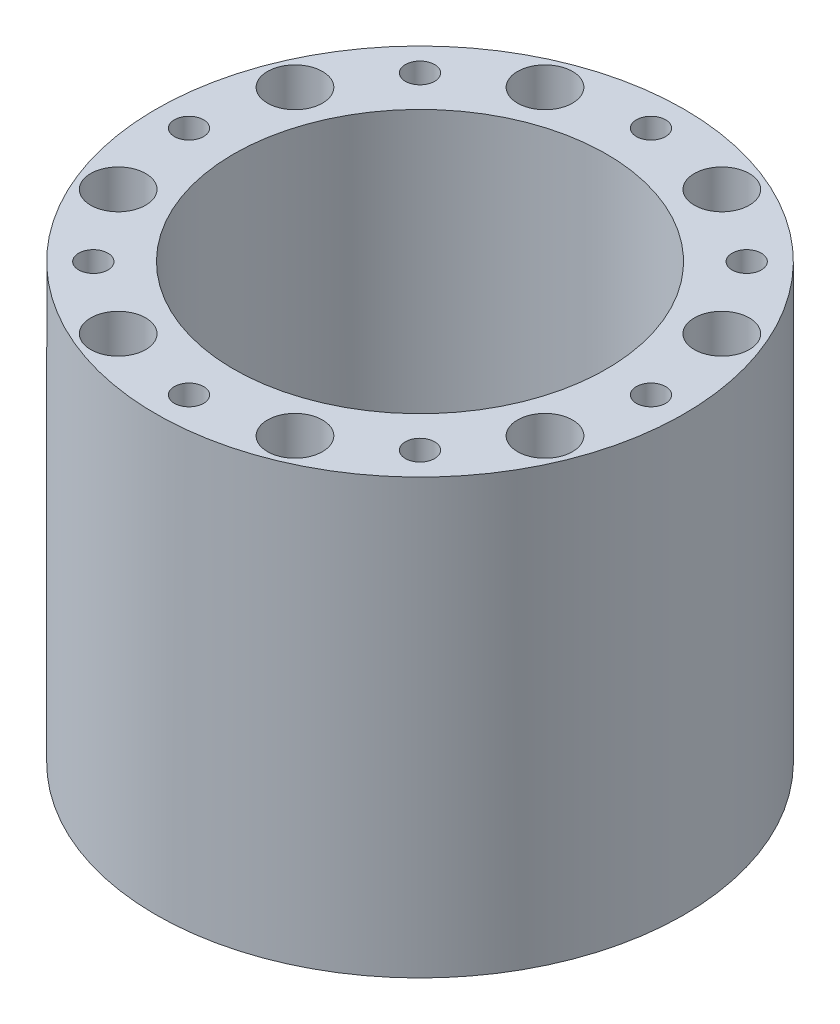
ISO-10303-21;
HEADER;
FILE_DESCRIPTION(('STEP AP214'),'2;1');
FILE_NAME('part.step','',(''),(''),'','','');
FILE_SCHEMA(('AUTOMOTIVE_DESIGN { 1 0 10303 214 1 1 1 1 }'));
ENDSEC;
DATA;
#1=APPLICATION_CONTEXT('core data for automotive mechanical design processes');
#2=APPLICATION_PROTOCOL_DEFINITION('international standard','automotive_design',2000,#1);
#3=PRODUCT_CONTEXT('',#1,'mechanical');
#4=PRODUCT('Part','Part','',(#3));
#5=PRODUCT_RELATED_PRODUCT_CATEGORY('part','',(#4));
#6=PRODUCT_DEFINITION_FORMATION('','',#4);
#7=PRODUCT_DEFINITION_CONTEXT('part definition',#1,'design');
#8=PRODUCT_DEFINITION('design','',#6,#7);
#9=PRODUCT_DEFINITION_SHAPE('','',#8);
#10=(LENGTH_UNIT() NAMED_UNIT(*) SI_UNIT(.MILLI.,.METRE.));
#11=(NAMED_UNIT(*) PLANE_ANGLE_UNIT() SI_UNIT($,.RADIAN.));
#12=(NAMED_UNIT(*) SI_UNIT($,.STERADIAN.) SOLID_ANGLE_UNIT());
#13=UNCERTAINTY_MEASURE_WITH_UNIT(LENGTH_MEASURE(1.E-05),#10,'distance_accuracy_value','');
#14=(GEOMETRIC_REPRESENTATION_CONTEXT(3) GLOBAL_UNCERTAINTY_ASSIGNED_CONTEXT((#13)) GLOBAL_UNIT_ASSIGNED_CONTEXT((#10,
#11,#12)) REPRESENTATION_CONTEXT('',''));
#15=CARTESIAN_POINT('',(0.,0.,0.));
#16=DIRECTION('',(0.,0.,1.));
#17=DIRECTION('',(1.,0.,0.));
#18=AXIS2_PLACEMENT_3D('',#15,#16,#17);
#19=CARTESIAN_POINT('',(63.7922857500392,0.,41.677143361624));
#20=DIRECTION('',(0.,-1.,0.));
#21=DIRECTION('',(0.546944138603989,0.,-0.837169104331222));
#22=AXIS2_PLACEMENT_3D('',#19,#20,#21);
#23=PLANE('',#22);
#24=CARTESIAN_POINT('',(61.5996678301902,0.,-25.515417852942));
#25=DIRECTION('',(0.,1.,0.));
#26=DIRECTION('',(0.,0.,1.));
#27=AXIS2_PLACEMENT_3D('',#24,#25,#26);
#28=CIRCLE('',#27,7.93750000000001);
#29=CARTESIAN_POINT('',(61.5996678301902,0.,-17.577917852942));
#30=VERTEX_POINT('',#29);
#31=EDGE_CURVE('E634',#30,#30,#28,.T.);
#32=ORIENTED_EDGE('',*,*,#31,.F.);
#33=EDGE_LOOP('',(#32));
#34=FACE_BOUND('',#33,.T.);
#35=CARTESIAN_POINT('',(25.5154178529426,0.,-61.59966783019));
#36=DIRECTION('',(0.,1.,0.));
#37=DIRECTION('',(0.,0.,1.));
#38=AXIS2_PLACEMENT_3D('',#35,#36,#37);
#39=CIRCLE('',#38,7.9375);
#40=CARTESIAN_POINT('',(25.5154178529426,0.,-53.66216783019));
#41=VERTEX_POINT('',#40);
#42=EDGE_CURVE('E644',#41,#41,#39,.T.);
#43=ORIENTED_EDGE('',*,*,#42,.F.);
#44=EDGE_LOOP('',(#43));
#45=FACE_BOUND('',#44,.T.);
#46=CARTESIAN_POINT('',(-25.5154178529422,0.,-61.5996678301901));
#47=DIRECTION('',(0.,1.,0.));
#48=DIRECTION('',(0.,0.,1.));
#49=AXIS2_PLACEMENT_3D('',#46,#47,#48);
#50=CIRCLE('',#49,7.9375);
#51=CARTESIAN_POINT('',(-25.5154178529422,0.,-53.6621678301901));
#52=VERTEX_POINT('',#51);
#53=EDGE_CURVE('E656',#52,#52,#50,.T.);
#54=ORIENTED_EDGE('',*,*,#53,.F.);
#55=EDGE_LOOP('',(#54));
#56=FACE_BOUND('',#55,.T.);
#57=CARTESIAN_POINT('',(25.5154178529427,0.,61.5996678301899));
#58=DIRECTION('',(0.,1.,0.));
#59=DIRECTION('',(0.,0.,1.));
#60=AXIS2_PLACEMENT_3D('',#57,#58,#59);
#61=CIRCLE('',#60,7.9375);
#62=CARTESIAN_POINT('',(25.5154178529427,0.,69.5371678301899));
#63=VERTEX_POINT('',#62);
#64=EDGE_CURVE('E211',#63,#63,#61,.T.);
#65=ORIENTED_EDGE('',*,*,#64,.F.);
#66=EDGE_LOOP('',(#65));
#67=FACE_BOUND('',#66,.T.);
#68=CARTESIAN_POINT('',(47.1463446356136,0.,-47.1463446356125));
#69=DIRECTION('',(0.,1.,0.));
#70=DIRECTION('',(0.,0.,1.));
#71=AXIS2_PLACEMENT_3D('',#68,#69,#70);
#72=CIRCLE('',#71,4.21639999999999);
#73=CARTESIAN_POINT('',(47.1463446356136,0.,-42.9299446356125));
#74=VERTEX_POINT('',#73);
#75=EDGE_CURVE('E85',#74,#74,#72,.T.);
#76=ORIENTED_EDGE('',*,*,#75,.F.);
#77=EDGE_LOOP('',(#76));
#78=FACE_BOUND('',#77,.T.);
#79=CARTESIAN_POINT('',(6.98383554802098E-13,0.,-66.675));
#80=DIRECTION('',(0.,1.,0.));
#81=DIRECTION('',(0.,0.,1.));
#82=AXIS2_PLACEMENT_3D('',#79,#80,#81);
#83=CIRCLE('',#82,4.21639999999999);
#84=CARTESIAN_POINT('',(6.98383554802098E-13,0.,-62.4586));
#85=VERTEX_POINT('',#84);
#86=EDGE_CURVE('E84',#85,#85,#83,.T.);
#87=ORIENTED_EDGE('',*,*,#86,.F.);
#88=EDGE_LOOP('',(#87));
#89=FACE_BOUND('',#88,.T.);
#90=CARTESIAN_POINT('',(-47.1463446356126,0.,-47.1463446356135));
#91=DIRECTION('',(0.,1.,0.));
#92=DIRECTION('',(0.,0.,1.));
#93=AXIS2_PLACEMENT_3D('',#90,#91,#92);
#94=CIRCLE('',#93,4.21639999999999);
#95=CARTESIAN_POINT('',(-47.1463446356126,0.,-42.9299446356135));
#96=VERTEX_POINT('',#95);
#97=EDGE_CURVE('E97',#96,#96,#94,.T.);
#98=ORIENTED_EDGE('',*,*,#97,.F.);
#99=EDGE_LOOP('',(#98));
#100=FACE_BOUND('',#99,.T.);
#101=CARTESIAN_POINT('',(-66.675,0.,0.));
#102=DIRECTION('',(0.,1.,0.));
#103=DIRECTION('',(0.,0.,1.));
#104=AXIS2_PLACEMENT_3D('',#101,#102,#103);
#105=CIRCLE('',#104,4.21639999999999);
#106=CARTESIAN_POINT('',(-66.675,0.,4.21639999999999));
#107=VERTEX_POINT('',#106);
#108=EDGE_CURVE('E103',#107,#107,#105,.T.);
#109=ORIENTED_EDGE('',*,*,#108,.F.);
#110=EDGE_LOOP('',(#109));
#111=FACE_BOUND('',#110,.T.);
#112=CARTESIAN_POINT('',(-47.1463446356133,0.,47.1463446356128));
#113=DIRECTION('',(0.,1.,0.));
#114=DIRECTION('',(0.,0.,1.));
#115=AXIS2_PLACEMENT_3D('',#112,#113,#114);
#116=CIRCLE('',#115,4.21639999999999);
#117=CARTESIAN_POINT('',(-47.1463446356133,0.,51.3627446356128));
#118=VERTEX_POINT('',#117);
#119=EDGE_CURVE('E109',#118,#118,#116,.T.);
#120=ORIENTED_EDGE('',*,*,#119,.F.);
#121=EDGE_LOOP('',(#120));
#122=FACE_BOUND('',#121,.T.);
#123=CARTESIAN_POINT('',(-2.32794518267366E-13,0.,66.675));
#124=DIRECTION('',(0.,1.,0.));
#125=DIRECTION('',(0.,0.,1.));
#126=AXIS2_PLACEMENT_3D('',#123,#124,#125);
#127=CIRCLE('',#126,4.21639999999999);
#128=CARTESIAN_POINT('',(-2.32794518267366E-13,0.,70.8914));
#129=VERTEX_POINT('',#128);
#130=EDGE_CURVE('E115',#129,#129,#127,.T.);
#131=ORIENTED_EDGE('',*,*,#130,.F.);
#132=EDGE_LOOP('',(#131));
#133=FACE_BOUND('',#132,.T.);
#134=CARTESIAN_POINT('',(47.146344635613,0.,47.1463446356131));
#135=DIRECTION('',(0.,1.,0.));
#136=DIRECTION('',(0.,0.,1.));
#137=AXIS2_PLACEMENT_3D('',#134,#135,#136);
#138=CIRCLE('',#137,4.21639999999999);
#139=CARTESIAN_POINT('',(47.146344635613,0.,51.3627446356131));
#140=VERTEX_POINT('',#139);
#141=EDGE_CURVE('E121',#140,#140,#138,.T.);
#142=ORIENTED_EDGE('',*,*,#141,.F.);
#143=EDGE_LOOP('',(#142));
#144=FACE_BOUND('',#143,.T.);
#145=CARTESIAN_POINT('',(66.675,0.,0.));
#146=DIRECTION('',(0.,1.,0.));
#147=DIRECTION('',(0.,0.,1.));
#148=AXIS2_PLACEMENT_3D('',#145,#146,#147);
#149=CIRCLE('',#148,4.21639999999999);
#150=CARTESIAN_POINT('',(66.675,0.,4.21639999999999));
#151=VERTEX_POINT('',#150);
#152=EDGE_CURVE('E127',#151,#151,#149,.T.);
#153=ORIENTED_EDGE('',*,*,#152,.F.);
#154=EDGE_LOOP('',(#153));
#155=FACE_BOUND('',#154,.T.);
#156=CARTESIAN_POINT('',(0.,0.,0.));
#157=DIRECTION('',(0.,-1.,0.));
#158=DIRECTION('',(0.546944138603989,0.,-0.837169104331222));
#159=AXIS2_PLACEMENT_3D('',#156,#157,#158);
#160=CIRCLE('',#159,76.2);
#161=CARTESIAN_POINT('',(41.6771433616239,0.,-63.7922857500391));
#162=VERTEX_POINT('',#161);
#163=EDGE_CURVE('E133',#162,#162,#160,.T.);
#164=ORIENTED_EDGE('',*,*,#163,.F.);
#165=EDGE_LOOP('',(#164));
#166=FACE_BOUND('',#165,.T.);
#167=CARTESIAN_POINT('',(0.,0.,0.));
#168=DIRECTION('',(0.,-1.,0.));
#169=DIRECTION('',(0.546944138603989,0.,-0.837169104331222));
#170=AXIS2_PLACEMENT_3D('',#167,#168,#169);
#171=CIRCLE('',#170,53.7924602426016);
#172=CARTESIAN_POINT('',(29.421470830779,0.,-45.0333857610717));
#173=VERTEX_POINT('',#172);
#174=EDGE_CURVE('E136',#173,#173,#171,.T.);
#175=ORIENTED_EDGE('',*,*,#174,.T.);
#176=EDGE_LOOP('',(#175));
#177=FACE_BOUND('',#176,.T.);
#178=CARTESIAN_POINT('',(61.5996678301902,0.,25.515417852942));
#179=DIRECTION('',(0.,1.,0.));
#180=DIRECTION('',(0.,0.,1.));
#181=AXIS2_PLACEMENT_3D('',#178,#179,#180);
#182=CIRCLE('',#181,7.9375);
#183=CARTESIAN_POINT('',(61.5996678301902,0.,33.452917852942));
#184=VERTEX_POINT('',#183);
#185=EDGE_CURVE('E162',#184,#184,#182,.T.);
#186=ORIENTED_EDGE('',*,*,#185,.F.);
#187=EDGE_LOOP('',(#186));
#188=FACE_BOUND('',#187,.T.);
#189=CARTESIAN_POINT('',(-25.5154178529422,0.,61.5996678301901));
#190=DIRECTION('',(0.,1.,0.));
#191=DIRECTION('',(0.,0.,1.));
#192=AXIS2_PLACEMENT_3D('',#189,#190,#191);
#193=CIRCLE('',#192,7.9375);
#194=CARTESIAN_POINT('',(-25.5154178529422,0.,69.5371678301901));
#195=VERTEX_POINT('',#194);
#196=EDGE_CURVE('E166',#195,#195,#193,.T.);
#197=ORIENTED_EDGE('',*,*,#196,.F.);
#198=EDGE_LOOP('',(#197));
#199=FACE_BOUND('',#198,.T.);
#200=CARTESIAN_POINT('',(-61.59966783019,0.,25.5154178529424));
#201=DIRECTION('',(0.,1.,0.));
#202=DIRECTION('',(0.,0.,1.));
#203=AXIS2_PLACEMENT_3D('',#200,#201,#202);
#204=CIRCLE('',#203,7.9375);
#205=CARTESIAN_POINT('',(-61.59966783019,0.,33.4529178529424));
#206=VERTEX_POINT('',#205);
#207=EDGE_CURVE('E170',#206,#206,#204,.T.);
#208=ORIENTED_EDGE('',*,*,#207,.F.);
#209=EDGE_LOOP('',(#208));
#210=FACE_BOUND('',#209,.T.);
#211=CARTESIAN_POINT('',(-61.5996678301902,0.,-25.515417852942));
#212=DIRECTION('',(0.,1.,0.));
#213=DIRECTION('',(0.,0.,1.));
#214=AXIS2_PLACEMENT_3D('',#211,#212,#213);
#215=CIRCLE('',#214,7.9375);
#216=CARTESIAN_POINT('',(-61.5996678301902,0.,-17.577917852942));
#217=VERTEX_POINT('',#216);
#218=EDGE_CURVE('E173',#217,#217,#215,.T.);
#219=ORIENTED_EDGE('',*,*,#218,.F.);
#220=EDGE_LOOP('',(#219));
#221=FACE_BOUND('',#220,.T.);
#222=ADVANCED_FACE('F41',(#34,#45,#56,#67,#78,#89,#100,#111,#122,#133,#144,#155,#166,#177,#188,
#199,#210,#221),#23,.F.);
#223=CARTESIAN_POINT('',(-105.474898553049,-125.205020782532,22.1235140794585));
#224=DIRECTION('',(0.,1.,0.));
#225=DIRECTION('',(-0.546944138603989,0.,0.837169104331222));
#226=AXIS2_PLACEMENT_3D('',#223,#224,#225);
#227=PLANE('',#226);
#228=CARTESIAN_POINT('',(61.5996678301902,-125.205020782532,-25.515417852942));
#229=DIRECTION('',(0.,1.,0.));
#230=DIRECTION('',(0.,0.,1.));
#231=AXIS2_PLACEMENT_3D('',#228,#229,#230);
#232=CIRCLE('',#231,4.90219999999997);
#233=CARTESIAN_POINT('',(61.5996678301902,-125.205020782532,-20.613217852942));
#234=VERTEX_POINT('',#233);
#235=EDGE_CURVE('E641',#234,#234,#232,.T.);
#236=ORIENTED_EDGE('',*,*,#235,.T.);
#237=EDGE_LOOP('',(#236));
#238=FACE_BOUND('',#237,.T.);
#239=CARTESIAN_POINT('',(25.5154178529426,-125.205020782532,-61.59966783019));
#240=DIRECTION('',(0.,1.,0.));
#241=DIRECTION('',(0.,0.,1.));
#242=AXIS2_PLACEMENT_3D('',#239,#240,#241);
#243=CIRCLE('',#242,4.90219999999997);
#244=CARTESIAN_POINT('',(25.5154178529426,-125.205020782532,-56.69746783019));
#245=VERTEX_POINT('',#244);
#246=EDGE_CURVE('E653',#245,#245,#243,.T.);
#247=ORIENTED_EDGE('',*,*,#246,.T.);
#248=EDGE_LOOP('',(#247));
#249=FACE_BOUND('',#248,.T.);
#250=CARTESIAN_POINT('',(-25.5154178529422,-125.205020782532,-61.5996678301901));
#251=DIRECTION('',(0.,1.,0.));
#252=DIRECTION('',(0.,0.,1.));
#253=AXIS2_PLACEMENT_3D('',#250,#251,#252);
#254=CIRCLE('',#253,4.90219999999997);
#255=CARTESIAN_POINT('',(-25.5154178529422,-125.205020782532,-56.6974678301901));
#256=VERTEX_POINT('',#255);
#257=EDGE_CURVE('E176',#256,#256,#254,.T.);
#258=ORIENTED_EDGE('',*,*,#257,.T.);
#259=EDGE_LOOP('',(#258));
#260=FACE_BOUND('',#259,.T.);
#261=CARTESIAN_POINT('',(-61.5996678301902,-125.205020782532,-25.515417852942));
#262=DIRECTION('',(0.,1.,0.));
#263=DIRECTION('',(0.,0.,1.));
#264=AXIS2_PLACEMENT_3D('',#261,#262,#263);
#265=CIRCLE('',#264,4.90219999999997);
#266=CARTESIAN_POINT('',(-61.5996678301902,-125.205020782532,-20.613217852942));
#267=VERTEX_POINT('',#266);
#268=EDGE_CURVE('E188',#267,#267,#265,.T.);
#269=ORIENTED_EDGE('',*,*,#268,.T.);
#270=EDGE_LOOP('',(#269));
#271=FACE_BOUND('',#270,.T.);
#272=CARTESIAN_POINT('',(-61.59966783019,-125.205020782532,25.5154178529424));
#273=DIRECTION('',(0.,1.,0.));
#274=DIRECTION('',(0.,0.,1.));
#275=AXIS2_PLACEMENT_3D('',#272,#273,#274);
#276=CIRCLE('',#275,4.90219999999997);
#277=CARTESIAN_POINT('',(-61.59966783019,-125.205020782532,30.4176178529424));
#278=VERTEX_POINT('',#277);
#279=EDGE_CURVE('E198',#278,#278,#276,.T.);
#280=ORIENTED_EDGE('',*,*,#279,.T.);
#281=EDGE_LOOP('',(#280));
#282=FACE_BOUND('',#281,.T.);
#283=CARTESIAN_POINT('',(-25.5154178529422,-125.205020782532,61.5996678301901));
#284=DIRECTION('',(0.,1.,0.));
#285=DIRECTION('',(0.,0.,1.));
#286=AXIS2_PLACEMENT_3D('',#283,#284,#285);
#287=CIRCLE('',#286,4.90219999999997);
#288=CARTESIAN_POINT('',(-25.5154178529422,-125.205020782532,66.5018678301901));
#289=VERTEX_POINT('',#288);
#290=EDGE_CURVE('E208',#289,#289,#287,.T.);
#291=ORIENTED_EDGE('',*,*,#290,.T.);
#292=EDGE_LOOP('',(#291));
#293=FACE_BOUND('',#292,.T.);
#294=CARTESIAN_POINT('',(25.5154178529427,-125.205020782532,61.5996678301899));
#295=DIRECTION('',(0.,1.,0.));
#296=DIRECTION('',(0.,0.,1.));
#297=AXIS2_PLACEMENT_3D('',#294,#295,#296);
#298=CIRCLE('',#297,4.90219999999997);
#299=CARTESIAN_POINT('',(25.5154178529427,-125.205020782532,66.5018678301899));
#300=VERTEX_POINT('',#299);
#301=EDGE_CURVE('E220',#300,#300,#298,.T.);
#302=ORIENTED_EDGE('',*,*,#301,.T.);
#303=EDGE_LOOP('',(#302));
#304=FACE_BOUND('',#303,.T.);
#305=CARTESIAN_POINT('',(61.5996678301902,-125.205020782532,25.515417852942));
#306=DIRECTION('',(0.,1.,0.));
#307=DIRECTION('',(0.,0.,1.));
#308=AXIS2_PLACEMENT_3D('',#305,#306,#307);
#309=CIRCLE('',#308,4.90219999999997);
#310=CARTESIAN_POINT('',(61.5996678301902,-125.205020782532,30.4176178529419));
#311=VERTEX_POINT('',#310);
#312=EDGE_CURVE('E91',#311,#311,#309,.T.);
#313=ORIENTED_EDGE('',*,*,#312,.T.);
#314=EDGE_LOOP('',(#313));
#315=FACE_BOUND('',#314,.T.);
#316=CARTESIAN_POINT('',(0.,-125.205020782532,0.));
#317=DIRECTION('',(0.,1.,0.));
#318=DIRECTION('',(-0.546944138603989,0.,0.837169104331222));
#319=AXIS2_PLACEMENT_3D('',#316,#317,#318);
#320=CIRCLE('',#319,76.2);
#321=CARTESIAN_POINT('',(-41.6771433616239,-125.205020782532,63.7922857500391));
#322=VERTEX_POINT('',#321);
#323=EDGE_CURVE('E49',#322,#322,#320,.T.);
#324=ORIENTED_EDGE('',*,*,#323,.F.);
#325=EDGE_LOOP('',(#324));
#326=FACE_BOUND('',#325,.T.);
#327=CARTESIAN_POINT('',(0.,-125.205020782532,0.));
#328=DIRECTION('',(0.,1.,0.));
#329=DIRECTION('',(-0.546944138603989,0.,0.837169104331222));
#330=AXIS2_PLACEMENT_3D('',#327,#328,#329);
#331=CIRCLE('',#330,53.7924602426016);
#332=CARTESIAN_POINT('',(-29.421470830779,-125.205020782532,45.0333857610717));
#333=VERTEX_POINT('',#332);
#334=EDGE_CURVE('E11',#333,#333,#331,.F.);
#335=ORIENTED_EDGE('',*,*,#334,.F.);
#336=EDGE_LOOP('',(#335));
#337=FACE_BOUND('',#336,.T.);
#338=ADVANCED_FACE('F43',(#238,#249,#260,#271,#282,#293,#304,#315,#326,#337),#227,.F.);
#339=CARTESIAN_POINT('',(0.,-193.077673705898,0.));
#340=DIRECTION('',(0.,-1.,0.));
#341=DIRECTION('',(0.546944138603989,0.,-0.837169104331222));
#342=AXIS2_PLACEMENT_3D('',#339,#340,#341);
#343=CYLINDRICAL_SURFACE('',#342,76.2);
#344=ORIENTED_EDGE('',*,*,#323,.T.);
#345=EDGE_LOOP('',(#344));
#346=FACE_BOUND('',#345,.T.);
#347=ORIENTED_EDGE('',*,*,#163,.T.);
#348=EDGE_LOOP('',(#347));
#349=FACE_BOUND('',#348,.T.);
#350=ADVANCED_FACE('F141',(#346,#349),#343,.T.);
#351=CARTESIAN_POINT('',(0.,-193.077673705898,0.));
#352=DIRECTION('',(0.,-1.,0.));
#353=DIRECTION('',(0.546944138603989,0.,-0.837169104331222));
#354=AXIS2_PLACEMENT_3D('',#351,#352,#353);
#355=CYLINDRICAL_SURFACE('',#354,53.7924602426016);
#356=ORIENTED_EDGE('',*,*,#334,.T.);
#357=EDGE_LOOP('',(#356));
#358=FACE_BOUND('',#357,.T.);
#359=ORIENTED_EDGE('',*,*,#174,.F.);
#360=EDGE_LOOP('',(#359));
#361=FACE_BOUND('',#360,.T.);
#362=ADVANCED_FACE('F147',(#358,#361),#355,.F.);
#363=CARTESIAN_POINT('',(66.675,-27.30754,0.));
#364=DIRECTION('',(0.,1.,0.));
#365=DIRECTION('',(0.,0.,1.));
#366=AXIS2_PLACEMENT_3D('',#363,#364,#365);
#367=CONICAL_SURFACE('',#366,4.21639999999999,1.02974425867665);
#368=CARTESIAN_POINT('',(66.675,-29.8410087140678,0.));
#369=VERTEX_POINT('',#368);
#370=VERTEX_LOOP('',#369);
#371=FACE_BOUND('',#370,.T.);
#372=CARTESIAN_POINT('',(66.675,-27.30754,0.));
#373=DIRECTION('',(0.,1.,0.));
#374=DIRECTION('',(0.,0.,1.));
#375=AXIS2_PLACEMENT_3D('',#372,#373,#374);
#376=CIRCLE('',#375,4.21639999999999);
#377=CARTESIAN_POINT('',(66.675,-27.30754,4.21639999999999));
#378=VERTEX_POINT('',#377);
#379=EDGE_CURVE('E130',#378,#378,#376,.T.);
#380=ORIENTED_EDGE('',*,*,#379,.T.);
#381=EDGE_LOOP('',(#380));
#382=FACE_BOUND('',#381,.T.);
#383=ADVANCED_FACE('F152',(#371,#382),#367,.F.);
#384=CARTESIAN_POINT('',(66.675,0.,0.));
#385=DIRECTION('',(0.,1.,0.));
#386=DIRECTION('',(0.,0.,1.));
#387=AXIS2_PLACEMENT_3D('',#384,#385,#386);
#388=CYLINDRICAL_SURFACE('',#387,4.21639999999999);
#389=ORIENTED_EDGE('',*,*,#379,.F.);
#390=EDGE_LOOP('',(#389));
#391=FACE_BOUND('',#390,.T.);
#392=ORIENTED_EDGE('',*,*,#152,.T.);
#393=EDGE_LOOP('',(#392));
#394=FACE_BOUND('',#393,.T.);
#395=ADVANCED_FACE('F306',(#391,#394),#388,.F.);
#396=CARTESIAN_POINT('',(47.146344635613,-27.30754,47.1463446356131));
#397=DIRECTION('',(0.,1.,0.));
#398=DIRECTION('',(0.,0.,1.));
#399=AXIS2_PLACEMENT_3D('',#396,#397,#398);
#400=CONICAL_SURFACE('',#399,4.21639999999999,1.02974425867665);
#401=CARTESIAN_POINT('',(47.146344635613,-29.8410087140678,47.1463446356131));
#402=VERTEX_POINT('',#401);
#403=VERTEX_LOOP('',#402);
#404=FACE_BOUND('',#403,.T.);
#405=CARTESIAN_POINT('',(47.146344635613,-27.30754,47.1463446356131));
#406=DIRECTION('',(0.,1.,0.));
#407=DIRECTION('',(0.,0.,1.));
#408=AXIS2_PLACEMENT_3D('',#405,#406,#407);
#409=CIRCLE('',#408,4.21639999999999);
#410=CARTESIAN_POINT('',(47.146344635613,-27.30754,51.3627446356131));
#411=VERTEX_POINT('',#410);
#412=EDGE_CURVE('E124',#411,#411,#409,.T.);
#413=ORIENTED_EDGE('',*,*,#412,.T.);
#414=EDGE_LOOP('',(#413));
#415=FACE_BOUND('',#414,.T.);
#416=ADVANCED_FACE('F302',(#404,#415),#400,.F.);
#417=CARTESIAN_POINT('',(47.146344635613,0.,47.1463446356131));
#418=DIRECTION('',(0.,1.,0.));
#419=DIRECTION('',(0.,0.,1.));
#420=AXIS2_PLACEMENT_3D('',#417,#418,#419);
#421=CYLINDRICAL_SURFACE('',#420,4.21639999999999);
#422=ORIENTED_EDGE('',*,*,#412,.F.);
#423=EDGE_LOOP('',(#422));
#424=FACE_BOUND('',#423,.T.);
#425=ORIENTED_EDGE('',*,*,#141,.T.);
#426=EDGE_LOOP('',(#425));
#427=FACE_BOUND('',#426,.T.);
#428=ADVANCED_FACE('F298',(#424,#427),#421,.F.);
#429=CARTESIAN_POINT('',(-2.32794518267366E-13,-27.30754,66.675));
#430=DIRECTION('',(0.,1.,0.));
#431=DIRECTION('',(0.,0.,1.));
#432=AXIS2_PLACEMENT_3D('',#429,#430,#431);
#433=CONICAL_SURFACE('',#432,4.21639999999999,1.02974425867665);
#434=CARTESIAN_POINT('',(-2.40103457428368E-13,-29.8410087140678,66.675));
#435=VERTEX_POINT('',#434);
#436=VERTEX_LOOP('',#435);
#437=FACE_BOUND('',#436,.T.);
#438=CARTESIAN_POINT('',(-2.32794518267366E-13,-27.30754,66.675));
#439=DIRECTION('',(0.,1.,0.));
#440=DIRECTION('',(0.,0.,1.));
#441=AXIS2_PLACEMENT_3D('',#438,#439,#440);
#442=CIRCLE('',#441,4.21639999999999);
#443=CARTESIAN_POINT('',(-2.32794518267366E-13,-27.30754,70.8914));
#444=VERTEX_POINT('',#443);
#445=EDGE_CURVE('E118',#444,#444,#442,.T.);
#446=ORIENTED_EDGE('',*,*,#445,.T.);
#447=EDGE_LOOP('',(#446));
#448=FACE_BOUND('',#447,.T.);
#449=ADVANCED_FACE('F294',(#437,#448),#433,.F.);
#450=CARTESIAN_POINT('',(-2.32794518267366E-13,0.,66.675));
#451=DIRECTION('',(0.,1.,0.));
#452=DIRECTION('',(0.,0.,1.));
#453=AXIS2_PLACEMENT_3D('',#450,#451,#452);
#454=CYLINDRICAL_SURFACE('',#453,4.21639999999999);
#455=ORIENTED_EDGE('',*,*,#445,.F.);
#456=EDGE_LOOP('',(#455));
#457=FACE_BOUND('',#456,.T.);
#458=ORIENTED_EDGE('',*,*,#130,.T.);
#459=EDGE_LOOP('',(#458));
#460=FACE_BOUND('',#459,.T.);
#461=ADVANCED_FACE('F290',(#457,#460),#454,.F.);
#462=CARTESIAN_POINT('',(-47.1463446356133,-27.30754,47.1463446356128));
#463=DIRECTION('',(0.,1.,0.));
#464=DIRECTION('',(0.,0.,1.));
#465=AXIS2_PLACEMENT_3D('',#462,#463,#464);
#466=CONICAL_SURFACE('',#465,4.21639999999999,1.02974425867665);
#467=CARTESIAN_POINT('',(-47.1463446356133,-29.8410087140678,47.1463446356128));
#468=VERTEX_POINT('',#467);
#469=VERTEX_LOOP('',#468);
#470=FACE_BOUND('',#469,.T.);
#471=CARTESIAN_POINT('',(-47.1463446356133,-27.30754,47.1463446356128));
#472=DIRECTION('',(0.,1.,0.));
#473=DIRECTION('',(0.,0.,1.));
#474=AXIS2_PLACEMENT_3D('',#471,#472,#473);
#475=CIRCLE('',#474,4.21639999999999);
#476=CARTESIAN_POINT('',(-47.1463446356133,-27.30754,51.3627446356128));
#477=VERTEX_POINT('',#476);
#478=EDGE_CURVE('E112',#477,#477,#475,.T.);
#479=ORIENTED_EDGE('',*,*,#478,.T.);
#480=EDGE_LOOP('',(#479));
#481=FACE_BOUND('',#480,.T.);
#482=ADVANCED_FACE('F286',(#470,#481),#466,.F.);
#483=CARTESIAN_POINT('',(-47.1463446356133,0.,47.1463446356128));
#484=DIRECTION('',(0.,1.,0.));
#485=DIRECTION('',(0.,0.,1.));
#486=AXIS2_PLACEMENT_3D('',#483,#484,#485);
#487=CYLINDRICAL_SURFACE('',#486,4.21639999999999);
#488=ORIENTED_EDGE('',*,*,#478,.F.);
#489=EDGE_LOOP('',(#488));
#490=FACE_BOUND('',#489,.T.);
#491=ORIENTED_EDGE('',*,*,#119,.T.);
#492=EDGE_LOOP('',(#491));
#493=FACE_BOUND('',#492,.T.);
#494=ADVANCED_FACE('F282',(#490,#493),#487,.F.);
#495=CARTESIAN_POINT('',(-66.675,-27.30754,0.));
#496=DIRECTION('',(0.,1.,0.));
#497=DIRECTION('',(0.,0.,1.));
#498=AXIS2_PLACEMENT_3D('',#495,#496,#497);
#499=CONICAL_SURFACE('',#498,4.21639999999999,1.02974425867665);
#500=CARTESIAN_POINT('',(-66.675,-29.8410087140678,0.));
#501=VERTEX_POINT('',#500);
#502=VERTEX_LOOP('',#501);
#503=FACE_BOUND('',#502,.T.);
#504=CARTESIAN_POINT('',(-66.675,-27.30754,0.));
#505=DIRECTION('',(0.,1.,0.));
#506=DIRECTION('',(0.,0.,1.));
#507=AXIS2_PLACEMENT_3D('',#504,#505,#506);
#508=CIRCLE('',#507,4.21639999999999);
#509=CARTESIAN_POINT('',(-66.675,-27.30754,4.21639999999999));
#510=VERTEX_POINT('',#509);
#511=EDGE_CURVE('E106',#510,#510,#508,.T.);
#512=ORIENTED_EDGE('',*,*,#511,.T.);
#513=EDGE_LOOP('',(#512));
#514=FACE_BOUND('',#513,.T.);
#515=ADVANCED_FACE('F278',(#503,#514),#499,.F.);
#516=CARTESIAN_POINT('',(-66.675,0.,0.));
#517=DIRECTION('',(0.,1.,0.));
#518=DIRECTION('',(0.,0.,1.));
#519=AXIS2_PLACEMENT_3D('',#516,#517,#518);
#520=CYLINDRICAL_SURFACE('',#519,4.21639999999999);
#521=ORIENTED_EDGE('',*,*,#511,.F.);
#522=EDGE_LOOP('',(#521));
#523=FACE_BOUND('',#522,.T.);
#524=ORIENTED_EDGE('',*,*,#108,.T.);
#525=EDGE_LOOP('',(#524));
#526=FACE_BOUND('',#525,.T.);
#527=ADVANCED_FACE('F274',(#523,#526),#520,.F.);
#528=CARTESIAN_POINT('',(-47.1463446356126,-27.30754,-47.1463446356135));
#529=DIRECTION('',(0.,1.,0.));
#530=DIRECTION('',(0.,0.,1.));
#531=AXIS2_PLACEMENT_3D('',#528,#529,#530);
#532=CONICAL_SURFACE('',#531,4.21639999999999,1.02974425867665);
#533=CARTESIAN_POINT('',(-47.1463446356126,-29.8410087140678,-47.1463446356135));
#534=VERTEX_POINT('',#533);
#535=VERTEX_LOOP('',#534);
#536=FACE_BOUND('',#535,.T.);
#537=CARTESIAN_POINT('',(-47.1463446356126,-27.30754,-47.1463446356135));
#538=DIRECTION('',(0.,1.,0.));
#539=DIRECTION('',(0.,0.,1.));
#540=AXIS2_PLACEMENT_3D('',#537,#538,#539);
#541=CIRCLE('',#540,4.21639999999999);
#542=CARTESIAN_POINT('',(-47.1463446356126,-27.30754,-42.9299446356135));
#543=VERTEX_POINT('',#542);
#544=EDGE_CURVE('E100',#543,#543,#541,.T.);
#545=ORIENTED_EDGE('',*,*,#544,.T.);
#546=EDGE_LOOP('',(#545));
#547=FACE_BOUND('',#546,.T.);
#548=ADVANCED_FACE('F270',(#536,#547),#532,.F.);
#549=CARTESIAN_POINT('',(-47.1463446356126,0.,-47.1463446356135));
#550=DIRECTION('',(0.,1.,0.));
#551=DIRECTION('',(0.,0.,1.));
#552=AXIS2_PLACEMENT_3D('',#549,#550,#551);
#553=CYLINDRICAL_SURFACE('',#552,4.21639999999999);
#554=ORIENTED_EDGE('',*,*,#544,.F.);
#555=EDGE_LOOP('',(#554));
#556=FACE_BOUND('',#555,.T.);
#557=ORIENTED_EDGE('',*,*,#97,.T.);
#558=EDGE_LOOP('',(#557));
#559=FACE_BOUND('',#558,.T.);
#560=ADVANCED_FACE('F266',(#556,#559),#553,.F.);
#561=CARTESIAN_POINT('',(6.98383554802098E-13,-27.30754,-66.675));
#562=DIRECTION('',(0.,1.,0.));
#563=DIRECTION('',(0.,0.,1.));
#564=AXIS2_PLACEMENT_3D('',#561,#562,#563);
#565=CONICAL_SURFACE('',#564,4.21639999999999,1.02974425867665);
#566=CARTESIAN_POINT('',(6.91074615641096E-13,-29.8410087140678,-66.675));
#567=VERTEX_POINT('',#566);
#568=VERTEX_LOOP('',#567);
#569=FACE_BOUND('',#568,.T.);
#570=CARTESIAN_POINT('',(6.98383554802098E-13,-27.30754,-66.675));
#571=DIRECTION('',(0.,1.,0.));
#572=DIRECTION('',(0.,0.,1.));
#573=AXIS2_PLACEMENT_3D('',#570,#571,#572);
#574=CIRCLE('',#573,4.21639999999999);
#575=CARTESIAN_POINT('',(6.98383554802098E-13,-27.30754,-62.4586));
#576=VERTEX_POINT('',#575);
#577=EDGE_CURVE('E88',#576,#576,#574,.T.);
#578=ORIENTED_EDGE('',*,*,#577,.T.);
#579=EDGE_LOOP('',(#578));
#580=FACE_BOUND('',#579,.T.);
#581=ADVANCED_FACE('F262',(#569,#580),#565,.F.);
#582=CARTESIAN_POINT('',(6.98383554802098E-13,0.,-66.675));
#583=DIRECTION('',(0.,1.,0.));
#584=DIRECTION('',(0.,0.,1.));
#585=AXIS2_PLACEMENT_3D('',#582,#583,#584);
#586=CYLINDRICAL_SURFACE('',#585,4.21639999999999);
#587=ORIENTED_EDGE('',*,*,#577,.F.);
#588=EDGE_LOOP('',(#587));
#589=FACE_BOUND('',#588,.T.);
#590=ORIENTED_EDGE('',*,*,#86,.T.);
#591=EDGE_LOOP('',(#590));
#592=FACE_BOUND('',#591,.T.);
#593=ADVANCED_FACE('F78',(#589,#592),#586,.F.);
#594=CARTESIAN_POINT('',(47.1463446356136,-27.30754,-47.1463446356125));
#595=DIRECTION('',(0.,1.,0.));
#596=DIRECTION('',(0.,0.,1.));
#597=AXIS2_PLACEMENT_3D('',#594,#595,#596);
#598=CONICAL_SURFACE('',#597,4.21639999999999,1.02974425867665);
#599=CARTESIAN_POINT('',(47.1463446356136,-29.8410087140678,-47.1463446356125));
#600=VERTEX_POINT('',#599);
#601=VERTEX_LOOP('',#600);
#602=FACE_BOUND('',#601,.T.);
#603=CARTESIAN_POINT('',(47.1463446356136,-27.30754,-47.1463446356125));
#604=DIRECTION('',(0.,1.,0.));
#605=DIRECTION('',(0.,0.,1.));
#606=AXIS2_PLACEMENT_3D('',#603,#604,#605);
#607=CIRCLE('',#606,4.21639999999999);
#608=CARTESIAN_POINT('',(47.1463446356136,-27.30754,-42.9299446356125));
#609=VERTEX_POINT('',#608);
#610=EDGE_CURVE('E82',#609,#609,#607,.T.);
#611=ORIENTED_EDGE('',*,*,#610,.T.);
#612=EDGE_LOOP('',(#611));
#613=FACE_BOUND('',#612,.T.);
#614=ADVANCED_FACE('F74',(#602,#613),#598,.F.);
#615=CARTESIAN_POINT('',(47.1463446356136,0.,-47.1463446356125));
#616=DIRECTION('',(0.,1.,0.));
#617=DIRECTION('',(0.,0.,1.));
#618=AXIS2_PLACEMENT_3D('',#615,#616,#617);
#619=CYLINDRICAL_SURFACE('',#618,4.21639999999999);
#620=ORIENTED_EDGE('',*,*,#610,.F.);
#621=EDGE_LOOP('',(#620));
#622=FACE_BOUND('',#621,.T.);
#623=ORIENTED_EDGE('',*,*,#75,.T.);
#624=EDGE_LOOP('',(#623));
#625=FACE_BOUND('',#624,.T.);
#626=ADVANCED_FACE('F77',(#622,#625),#619,.F.);
#627=CARTESIAN_POINT('',(61.5996678301902,0.,25.515417852942));
#628=DIRECTION('',(0.,1.,0.));
#629=DIRECTION('',(0.,0.,1.));
#630=AXIS2_PLACEMENT_3D('',#627,#628,#629);
#631=CYLINDRICAL_SURFACE('',#630,4.90219999999999);
#632=ORIENTED_EDGE('',*,*,#312,.F.);
#633=EDGE_LOOP('',(#632));
#634=FACE_BOUND('',#633,.T.);
#635=CARTESIAN_POINT('',(61.5996678301902,-14.605,25.515417852942));
#636=DIRECTION('',(0.,1.,0.));
#637=DIRECTION('',(0.,0.,1.));
#638=AXIS2_PLACEMENT_3D('',#635,#636,#637);
#639=CIRCLE('',#638,4.90220000000001);
#640=CARTESIAN_POINT('',(61.5996678301902,-14.605,30.417617852942));
#641=VERTEX_POINT('',#640);
#642=EDGE_CURVE('E227',#641,#641,#639,.T.);
#643=ORIENTED_EDGE('',*,*,#642,.T.);
#644=EDGE_LOOP('',(#643));
#645=FACE_BOUND('',#644,.T.);
#646=ADVANCED_FACE('F233',(#634,#645),#631,.F.);
#647=CARTESIAN_POINT('',(66.5018678301902,-14.605,25.515417852942));
#648=DIRECTION('',(0.,-1.,0.));
#649=DIRECTION('',(0.,0.,-1.));
#650=AXIS2_PLACEMENT_3D('',#647,#648,#649);
#651=PLANE('',#650);
#652=ORIENTED_EDGE('',*,*,#642,.F.);
#653=EDGE_LOOP('',(#652));
#654=FACE_BOUND('',#653,.T.);
#655=CARTESIAN_POINT('',(61.5996678301902,-14.605,25.515417852942));
#656=DIRECTION('',(0.,1.,0.));
#657=DIRECTION('',(0.,0.,1.));
#658=AXIS2_PLACEMENT_3D('',#655,#656,#657);
#659=CIRCLE('',#658,7.9375);
#660=CARTESIAN_POINT('',(61.5996678301902,-14.605,33.452917852942));
#661=VERTEX_POINT('',#660);
#662=EDGE_CURVE('E224',#661,#661,#659,.T.);
#663=ORIENTED_EDGE('',*,*,#662,.T.);
#664=EDGE_LOOP('',(#663));
#665=FACE_BOUND('',#664,.T.);
#666=ADVANCED_FACE('F236',(#654,#665),#651,.F.);
#667=CARTESIAN_POINT('',(61.5996678301902,0.,25.515417852942));
#668=DIRECTION('',(0.,1.,0.));
#669=DIRECTION('',(0.,0.,1.));
#670=AXIS2_PLACEMENT_3D('',#667,#668,#669);
#671=CYLINDRICAL_SURFACE('',#670,7.9375);
#672=ORIENTED_EDGE('',*,*,#662,.F.);
#673=EDGE_LOOP('',(#672));
#674=FACE_BOUND('',#673,.T.);
#675=ORIENTED_EDGE('',*,*,#185,.T.);
#676=EDGE_LOOP('',(#675));
#677=FACE_BOUND('',#676,.T.);
#678=ADVANCED_FACE('F242',(#674,#677),#671,.F.);
#679=CARTESIAN_POINT('',(25.5154178529427,0.,61.5996678301899));
#680=DIRECTION('',(0.,1.,0.));
#681=DIRECTION('',(0.,0.,1.));
#682=AXIS2_PLACEMENT_3D('',#679,#680,#681);
#683=CYLINDRICAL_SURFACE('',#682,4.90219999999999);
#684=ORIENTED_EDGE('',*,*,#301,.F.);
#685=EDGE_LOOP('',(#684));
#686=FACE_BOUND('',#685,.T.);
#687=CARTESIAN_POINT('',(25.5154178529427,-14.605,61.5996678301899));
#688=DIRECTION('',(0.,1.,0.));
#689=DIRECTION('',(0.,0.,1.));
#690=AXIS2_PLACEMENT_3D('',#687,#688,#689);
#691=CIRCLE('',#690,4.90220000000001);
#692=CARTESIAN_POINT('',(25.5154178529427,-14.605,66.50186783019));
#693=VERTEX_POINT('',#692);
#694=EDGE_CURVE('E217',#693,#693,#691,.T.);
#695=ORIENTED_EDGE('',*,*,#694,.T.);
#696=EDGE_LOOP('',(#695));
#697=FACE_BOUND('',#696,.T.);
#698=ADVANCED_FACE('F248',(#686,#697),#683,.F.);
#699=CARTESIAN_POINT('',(30.4176178529427,-14.605,61.5996678301899));
#700=DIRECTION('',(0.,-1.,0.));
#701=DIRECTION('',(0.,0.,-1.));
#702=AXIS2_PLACEMENT_3D('',#699,#700,#701);
#703=PLANE('',#702);
#704=ORIENTED_EDGE('',*,*,#694,.F.);
#705=EDGE_LOOP('',(#704));
#706=FACE_BOUND('',#705,.T.);
#707=CARTESIAN_POINT('',(25.5154178529427,-14.605,61.5996678301899));
#708=DIRECTION('',(0.,1.,0.));
#709=DIRECTION('',(0.,0.,1.));
#710=AXIS2_PLACEMENT_3D('',#707,#708,#709);
#711=CIRCLE('',#710,7.9375);
#712=CARTESIAN_POINT('',(25.5154178529427,-14.605,69.5371678301899));
#713=VERTEX_POINT('',#712);
#714=EDGE_CURVE('E214',#713,#713,#711,.T.);
#715=ORIENTED_EDGE('',*,*,#714,.T.);
#716=EDGE_LOOP('',(#715));
#717=FACE_BOUND('',#716,.T.);
#718=ADVANCED_FACE('F253',(#706,#717),#703,.F.);
#719=CARTESIAN_POINT('',(25.5154178529427,0.,61.5996678301899));
#720=DIRECTION('',(0.,1.,0.));
#721=DIRECTION('',(0.,0.,1.));
#722=AXIS2_PLACEMENT_3D('',#719,#720,#721);
#723=CYLINDRICAL_SURFACE('',#722,7.9375);
#724=ORIENTED_EDGE('',*,*,#714,.F.);
#725=EDGE_LOOP('',(#724));
#726=FACE_BOUND('',#725,.T.);
#727=ORIENTED_EDGE('',*,*,#64,.T.);
#728=EDGE_LOOP('',(#727));
#729=FACE_BOUND('',#728,.T.);
#730=ADVANCED_FACE('F435',(#726,#729),#723,.F.);
#731=CARTESIAN_POINT('',(-25.5154178529422,0.,61.5996678301901));
#732=DIRECTION('',(0.,1.,0.));
#733=DIRECTION('',(0.,0.,1.));
#734=AXIS2_PLACEMENT_3D('',#731,#732,#733);
#735=CYLINDRICAL_SURFACE('',#734,4.90219999999999);
#736=ORIENTED_EDGE('',*,*,#290,.F.);
#737=EDGE_LOOP('',(#736));
#738=FACE_BOUND('',#737,.T.);
#739=CARTESIAN_POINT('',(-25.5154178529422,-14.605,61.5996678301901));
#740=DIRECTION('',(0.,1.,0.));
#741=DIRECTION('',(0.,0.,1.));
#742=AXIS2_PLACEMENT_3D('',#739,#740,#741);
#743=CIRCLE('',#742,4.90220000000001);
#744=CARTESIAN_POINT('',(-25.5154178529422,-14.605,66.5018678301901));
#745=VERTEX_POINT('',#744);
#746=EDGE_CURVE('E205',#745,#745,#743,.T.);
#747=ORIENTED_EDGE('',*,*,#746,.T.);
#748=EDGE_LOOP('',(#747));
#749=FACE_BOUND('',#748,.T.);
#750=ADVANCED_FACE('F444',(#738,#749),#735,.F.);
#751=CARTESIAN_POINT('',(-20.6132178529422,-14.605,61.5996678301901));
#752=DIRECTION('',(0.,-1.,0.));
#753=DIRECTION('',(0.,0.,-1.));
#754=AXIS2_PLACEMENT_3D('',#751,#752,#753);
#755=PLANE('',#754);
#756=ORIENTED_EDGE('',*,*,#746,.F.);
#757=EDGE_LOOP('',(#756));
#758=FACE_BOUND('',#757,.T.);
#759=CARTESIAN_POINT('',(-25.5154178529422,-14.605,61.5996678301901));
#760=DIRECTION('',(0.,1.,0.));
#761=DIRECTION('',(0.,0.,1.));
#762=AXIS2_PLACEMENT_3D('',#759,#760,#761);
#763=CIRCLE('',#762,7.9375);
#764=CARTESIAN_POINT('',(-25.5154178529422,-14.605,69.5371678301901));
#765=VERTEX_POINT('',#764);
#766=EDGE_CURVE('E202',#765,#765,#763,.T.);
#767=ORIENTED_EDGE('',*,*,#766,.T.);
#768=EDGE_LOOP('',(#767));
#769=FACE_BOUND('',#768,.T.);
#770=ADVANCED_FACE('F454',(#758,#769),#755,.F.);
#771=CARTESIAN_POINT('',(-25.5154178529422,0.,61.5996678301901));
#772=DIRECTION('',(0.,1.,0.));
#773=DIRECTION('',(0.,0.,1.));
#774=AXIS2_PLACEMENT_3D('',#771,#772,#773);
#775=CYLINDRICAL_SURFACE('',#774,7.9375);
#776=ORIENTED_EDGE('',*,*,#766,.F.);
#777=EDGE_LOOP('',(#776));
#778=FACE_BOUND('',#777,.T.);
#779=ORIENTED_EDGE('',*,*,#196,.T.);
#780=EDGE_LOOP('',(#779));
#781=FACE_BOUND('',#780,.T.);
#782=ADVANCED_FACE('F464',(#778,#781),#775,.F.);
#783=CARTESIAN_POINT('',(-61.59966783019,0.,25.5154178529424));
#784=DIRECTION('',(0.,1.,0.));
#785=DIRECTION('',(0.,0.,1.));
#786=AXIS2_PLACEMENT_3D('',#783,#784,#785);
#787=CYLINDRICAL_SURFACE('',#786,4.90219999999999);
#788=ORIENTED_EDGE('',*,*,#279,.F.);
#789=EDGE_LOOP('',(#788));
#790=FACE_BOUND('',#789,.T.);
#791=CARTESIAN_POINT('',(-61.59966783019,-14.605,25.5154178529424));
#792=DIRECTION('',(0.,1.,0.));
#793=DIRECTION('',(0.,0.,1.));
#794=AXIS2_PLACEMENT_3D('',#791,#792,#793);
#795=CIRCLE('',#794,4.90220000000001);
#796=CARTESIAN_POINT('',(-61.59966783019,-14.605,30.4176178529424));
#797=VERTEX_POINT('',#796);
#798=EDGE_CURVE('E195',#797,#797,#795,.T.);
#799=ORIENTED_EDGE('',*,*,#798,.T.);
#800=EDGE_LOOP('',(#799));
#801=FACE_BOUND('',#800,.T.);
#802=ADVANCED_FACE('F474',(#790,#801),#787,.F.);
#803=CARTESIAN_POINT('',(-56.69746783019,-14.605,25.5154178529424));
#804=DIRECTION('',(0.,-1.,0.));
#805=DIRECTION('',(0.,0.,-1.));
#806=AXIS2_PLACEMENT_3D('',#803,#804,#805);
#807=PLANE('',#806);
#808=ORIENTED_EDGE('',*,*,#798,.F.);
#809=EDGE_LOOP('',(#808));
#810=FACE_BOUND('',#809,.T.);
#811=CARTESIAN_POINT('',(-61.59966783019,-14.605,25.5154178529424));
#812=DIRECTION('',(0.,1.,0.));
#813=DIRECTION('',(0.,0.,1.));
#814=AXIS2_PLACEMENT_3D('',#811,#812,#813);
#815=CIRCLE('',#814,7.9375);
#816=CARTESIAN_POINT('',(-61.59966783019,-14.605,33.4529178529424));
#817=VERTEX_POINT('',#816);
#818=EDGE_CURVE('E192',#817,#817,#815,.T.);
#819=ORIENTED_EDGE('',*,*,#818,.T.);
#820=EDGE_LOOP('',(#819));
#821=FACE_BOUND('',#820,.T.);
#822=ADVANCED_FACE('F484',(#810,#821),#807,.F.);
#823=CARTESIAN_POINT('',(-61.59966783019,0.,25.5154178529424));
#824=DIRECTION('',(0.,1.,0.));
#825=DIRECTION('',(0.,0.,1.));
#826=AXIS2_PLACEMENT_3D('',#823,#824,#825);
#827=CYLINDRICAL_SURFACE('',#826,7.9375);
#828=ORIENTED_EDGE('',*,*,#818,.F.);
#829=EDGE_LOOP('',(#828));
#830=FACE_BOUND('',#829,.T.);
#831=ORIENTED_EDGE('',*,*,#207,.T.);
#832=EDGE_LOOP('',(#831));
#833=FACE_BOUND('',#832,.T.);
#834=ADVANCED_FACE('F494',(#830,#833),#827,.F.);
#835=CARTESIAN_POINT('',(-61.5996678301902,0.,-25.515417852942));
#836=DIRECTION('',(0.,1.,0.));
#837=DIRECTION('',(0.,0.,1.));
#838=AXIS2_PLACEMENT_3D('',#835,#836,#837);
#839=CYLINDRICAL_SURFACE('',#838,4.90219999999999);
#840=ORIENTED_EDGE('',*,*,#268,.F.);
#841=EDGE_LOOP('',(#840));
#842=FACE_BOUND('',#841,.T.);
#843=CARTESIAN_POINT('',(-61.5996678301902,-14.605,-25.515417852942));
#844=DIRECTION('',(0.,1.,0.));
#845=DIRECTION('',(0.,0.,1.));
#846=AXIS2_PLACEMENT_3D('',#843,#844,#845);
#847=CIRCLE('',#846,4.90220000000001);
#848=CARTESIAN_POINT('',(-61.5996678301902,-14.605,-20.613217852942));
#849=VERTEX_POINT('',#848);
#850=EDGE_CURVE('E179',#849,#849,#847,.T.);
#851=ORIENTED_EDGE('',*,*,#850,.T.);
#852=EDGE_LOOP('',(#851));
#853=FACE_BOUND('',#852,.T.);
#854=ADVANCED_FACE('F504',(#842,#853),#839,.F.);
#855=CARTESIAN_POINT('',(-56.6974678301902,-14.605,-25.515417852942));
#856=DIRECTION('',(0.,-1.,0.));
#857=DIRECTION('',(0.,0.,-1.));
#858=AXIS2_PLACEMENT_3D('',#855,#856,#857);
#859=PLANE('',#858);
#860=ORIENTED_EDGE('',*,*,#850,.F.);
#861=EDGE_LOOP('',(#860));
#862=FACE_BOUND('',#861,.T.);
#863=CARTESIAN_POINT('',(-61.5996678301902,-14.605,-25.515417852942));
#864=DIRECTION('',(0.,1.,0.));
#865=DIRECTION('',(0.,0.,1.));
#866=AXIS2_PLACEMENT_3D('',#863,#864,#865);
#867=CIRCLE('',#866,7.9375);
#868=CARTESIAN_POINT('',(-61.5996678301902,-14.605,-17.577917852942));
#869=VERTEX_POINT('',#868);
#870=EDGE_CURVE('E175',#869,#869,#867,.T.);
#871=ORIENTED_EDGE('',*,*,#870,.T.);
#872=EDGE_LOOP('',(#871));
#873=FACE_BOUND('',#872,.T.);
#874=ADVANCED_FACE('F514',(#862,#873),#859,.F.);
#875=CARTESIAN_POINT('',(-61.5996678301902,0.,-25.515417852942));
#876=DIRECTION('',(0.,1.,0.));
#877=DIRECTION('',(0.,0.,1.));
#878=AXIS2_PLACEMENT_3D('',#875,#876,#877);
#879=CYLINDRICAL_SURFACE('',#878,7.9375);
#880=ORIENTED_EDGE('',*,*,#870,.F.);
#881=EDGE_LOOP('',(#880));
#882=FACE_BOUND('',#881,.T.);
#883=ORIENTED_EDGE('',*,*,#218,.T.);
#884=EDGE_LOOP('',(#883));
#885=FACE_BOUND('',#884,.T.);
#886=ADVANCED_FACE('F524',(#882,#885),#879,.F.);
#887=CARTESIAN_POINT('',(-25.5154178529422,0.,-61.5996678301901));
#888=DIRECTION('',(0.,1.,0.));
#889=DIRECTION('',(0.,0.,1.));
#890=AXIS2_PLACEMENT_3D('',#887,#888,#889);
#891=CYLINDRICAL_SURFACE('',#890,4.90219999999999);
#892=ORIENTED_EDGE('',*,*,#257,.F.);
#893=EDGE_LOOP('',(#892));
#894=FACE_BOUND('',#893,.T.);
#895=CARTESIAN_POINT('',(-25.5154178529422,-14.605,-61.5996678301901));
#896=DIRECTION('',(0.,1.,0.));
#897=DIRECTION('',(0.,0.,1.));
#898=AXIS2_PLACEMENT_3D('',#895,#896,#897);
#899=CIRCLE('',#898,4.90220000000001);
#900=CARTESIAN_POINT('',(-25.5154178529422,-14.605,-56.6974678301901));
#901=VERTEX_POINT('',#900);
#902=EDGE_CURVE('E182',#901,#901,#899,.T.);
#903=ORIENTED_EDGE('',*,*,#902,.T.);
#904=EDGE_LOOP('',(#903));
#905=FACE_BOUND('',#904,.T.);
#906=ADVANCED_FACE('F534',(#894,#905),#891,.F.);
#907=CARTESIAN_POINT('',(-20.6132178529422,-14.605,-61.5996678301901));
#908=DIRECTION('',(0.,-1.,0.));
#909=DIRECTION('',(0.,0.,-1.));
#910=AXIS2_PLACEMENT_3D('',#907,#908,#909);
#911=PLANE('',#910);
#912=ORIENTED_EDGE('',*,*,#902,.F.);
#913=EDGE_LOOP('',(#912));
#914=FACE_BOUND('',#913,.T.);
#915=CARTESIAN_POINT('',(-25.5154178529422,-14.605,-61.5996678301901));
#916=DIRECTION('',(0.,1.,0.));
#917=DIRECTION('',(0.,0.,1.));
#918=AXIS2_PLACEMENT_3D('',#915,#916,#917);
#919=CIRCLE('',#918,7.9375);
#920=CARTESIAN_POINT('',(-25.5154178529422,-14.605,-53.6621678301901));
#921=VERTEX_POINT('',#920);
#922=EDGE_CURVE('E659',#921,#921,#919,.T.);
#923=ORIENTED_EDGE('',*,*,#922,.T.);
#924=EDGE_LOOP('',(#923));
#925=FACE_BOUND('',#924,.T.);
#926=ADVANCED_FACE('F544',(#914,#925),#911,.F.);
#927=CARTESIAN_POINT('',(-25.5154178529422,0.,-61.5996678301901));
#928=DIRECTION('',(0.,1.,0.));
#929=DIRECTION('',(0.,0.,1.));
#930=AXIS2_PLACEMENT_3D('',#927,#928,#929);
#931=CYLINDRICAL_SURFACE('',#930,7.9375);
#932=ORIENTED_EDGE('',*,*,#922,.F.);
#933=EDGE_LOOP('',(#932));
#934=FACE_BOUND('',#933,.T.);
#935=ORIENTED_EDGE('',*,*,#53,.T.);
#936=EDGE_LOOP('',(#935));
#937=FACE_BOUND('',#936,.T.);
#938=ADVANCED_FACE('F554',(#934,#937),#931,.F.);
#939=CARTESIAN_POINT('',(25.5154178529426,0.,-61.59966783019));
#940=DIRECTION('',(0.,1.,0.));
#941=DIRECTION('',(0.,0.,1.));
#942=AXIS2_PLACEMENT_3D('',#939,#940,#941);
#943=CYLINDRICAL_SURFACE('',#942,4.90219999999999);
#944=ORIENTED_EDGE('',*,*,#246,.F.);
#945=EDGE_LOOP('',(#944));
#946=FACE_BOUND('',#945,.T.);
#947=CARTESIAN_POINT('',(25.5154178529426,-14.605,-61.59966783019));
#948=DIRECTION('',(0.,1.,0.));
#949=DIRECTION('',(0.,0.,1.));
#950=AXIS2_PLACEMENT_3D('',#947,#948,#949);
#951=CIRCLE('',#950,4.90220000000001);
#952=CARTESIAN_POINT('',(25.5154178529426,-14.605,-56.6974678301899));
#953=VERTEX_POINT('',#952);
#954=EDGE_CURVE('E650',#953,#953,#951,.T.);
#955=ORIENTED_EDGE('',*,*,#954,.T.);
#956=EDGE_LOOP('',(#955));
#957=FACE_BOUND('',#956,.T.);
#958=ADVANCED_FACE('F564',(#946,#957),#943,.F.);
#959=CARTESIAN_POINT('',(30.4176178529426,-14.605,-61.59966783019));
#960=DIRECTION('',(0.,-1.,0.));
#961=DIRECTION('',(0.,0.,-1.));
#962=AXIS2_PLACEMENT_3D('',#959,#960,#961);
#963=PLANE('',#962);
#964=ORIENTED_EDGE('',*,*,#954,.F.);
#965=EDGE_LOOP('',(#964));
#966=FACE_BOUND('',#965,.T.);
#967=CARTESIAN_POINT('',(25.5154178529426,-14.605,-61.59966783019));
#968=DIRECTION('',(0.,1.,0.));
#969=DIRECTION('',(0.,0.,1.));
#970=AXIS2_PLACEMENT_3D('',#967,#968,#969);
#971=CIRCLE('',#970,7.93749999999999);
#972=CARTESIAN_POINT('',(25.5154178529426,-14.605,-53.66216783019));
#973=VERTEX_POINT('',#972);
#974=EDGE_CURVE('E647',#973,#973,#971,.T.);
#975=ORIENTED_EDGE('',*,*,#974,.T.);
#976=EDGE_LOOP('',(#975));
#977=FACE_BOUND('',#976,.T.);
#978=ADVANCED_FACE('F574',(#966,#977),#963,.F.);
#979=CARTESIAN_POINT('',(25.5154178529426,0.,-61.59966783019));
#980=DIRECTION('',(0.,1.,0.));
#981=DIRECTION('',(0.,0.,1.));
#982=AXIS2_PLACEMENT_3D('',#979,#980,#981);
#983=CYLINDRICAL_SURFACE('',#982,7.9375);
#984=ORIENTED_EDGE('',*,*,#974,.F.);
#985=EDGE_LOOP('',(#984));
#986=FACE_BOUND('',#985,.T.);
#987=ORIENTED_EDGE('',*,*,#42,.T.);
#988=EDGE_LOOP('',(#987));
#989=FACE_BOUND('',#988,.T.);
#990=ADVANCED_FACE('F584',(#986,#989),#983,.F.);
#991=CARTESIAN_POINT('',(61.5996678301902,0.,-25.515417852942));
#992=DIRECTION('',(0.,1.,0.));
#993=DIRECTION('',(0.,0.,1.));
#994=AXIS2_PLACEMENT_3D('',#991,#992,#993);
#995=CYLINDRICAL_SURFACE('',#994,4.9022);
#996=ORIENTED_EDGE('',*,*,#235,.F.);
#997=EDGE_LOOP('',(#996));
#998=FACE_BOUND('',#997,.T.);
#999=CARTESIAN_POINT('',(61.5996678301902,-14.605,-25.515417852942));
#1000=DIRECTION('',(0.,1.,0.));
#1001=DIRECTION('',(0.,0.,1.));
#1002=AXIS2_PLACEMENT_3D('',#999,#1000,#1001);
#1003=CIRCLE('',#1002,4.90220000000002);
#1004=CARTESIAN_POINT('',(61.5996678301902,-14.605,-20.613217852942));
#1005=VERTEX_POINT('',#1004);
#1006=EDGE_CURVE('E636',#1005,#1005,#1003,.T.);
#1007=ORIENTED_EDGE('',*,*,#1006,.T.);
#1008=EDGE_LOOP('',(#1007));
#1009=FACE_BOUND('',#1008,.T.);
#1010=ADVANCED_FACE('F594',(#998,#1009),#995,.F.);
#1011=CARTESIAN_POINT('',(66.5018678301902,-14.605,-25.515417852942));
#1012=DIRECTION('',(0.,-1.,0.));
#1013=DIRECTION('',(0.,0.,-1.));
#1014=AXIS2_PLACEMENT_3D('',#1011,#1012,#1013);
#1015=PLANE('',#1014);
#1016=ORIENTED_EDGE('',*,*,#1006,.F.);
#1017=EDGE_LOOP('',(#1016));
#1018=FACE_BOUND('',#1017,.T.);
#1019=CARTESIAN_POINT('',(61.5996678301902,-14.605,-25.515417852942));
#1020=DIRECTION('',(0.,1.,0.));
#1021=DIRECTION('',(0.,0.,1.));
#1022=AXIS2_PLACEMENT_3D('',#1019,#1020,#1021);
#1023=CIRCLE('',#1022,7.93749999999999);
#1024=CARTESIAN_POINT('',(61.5996678301902,-14.605,-17.577917852942));
#1025=VERTEX_POINT('',#1024);
#1026=EDGE_CURVE('E631',#1025,#1025,#1023,.T.);
#1027=ORIENTED_EDGE('',*,*,#1026,.T.);
#1028=EDGE_LOOP('',(#1027));
#1029=FACE_BOUND('',#1028,.T.);
#1030=ADVANCED_FACE('F604',(#1018,#1029),#1015,.F.);
#1031=CARTESIAN_POINT('',(61.5996678301902,0.,-25.515417852942));
#1032=DIRECTION('',(0.,1.,0.));
#1033=DIRECTION('',(0.,0.,1.));
#1034=AXIS2_PLACEMENT_3D('',#1031,#1032,#1033);
#1035=CYLINDRICAL_SURFACE('',#1034,7.9375);
#1036=ORIENTED_EDGE('',*,*,#1026,.F.);
#1037=EDGE_LOOP('',(#1036));
#1038=FACE_BOUND('',#1037,.T.);
#1039=ORIENTED_EDGE('',*,*,#31,.T.);
#1040=EDGE_LOOP('',(#1039));
#1041=FACE_BOUND('',#1040,.T.);
#1042=ADVANCED_FACE('F614',(#1038,#1041),#1035,.F.);
#1043=CLOSED_SHELL('',(#222,#338,#350,#362,#383,#395,#416,#428,#449,#461,#482,#494,#515,#527,
#548,#560,#581,#593,#614,#626,#646,#666,#678,#698,#718,#730,#750,#770,#782,#802,#822,#834,#854,
#874,#886,#906,#926,#938,#958,#978,#990,#1010,#1030,#1042));
#1044=MANIFOLD_SOLID_BREP('B2',#1043);
#1045=ADVANCED_BREP_SHAPE_REPRESENTATION('',(#18,#1044),#14);
#1046=SHAPE_DEFINITION_REPRESENTATION(#9,#1045);
ENDSEC;
END-ISO-10303-21;
